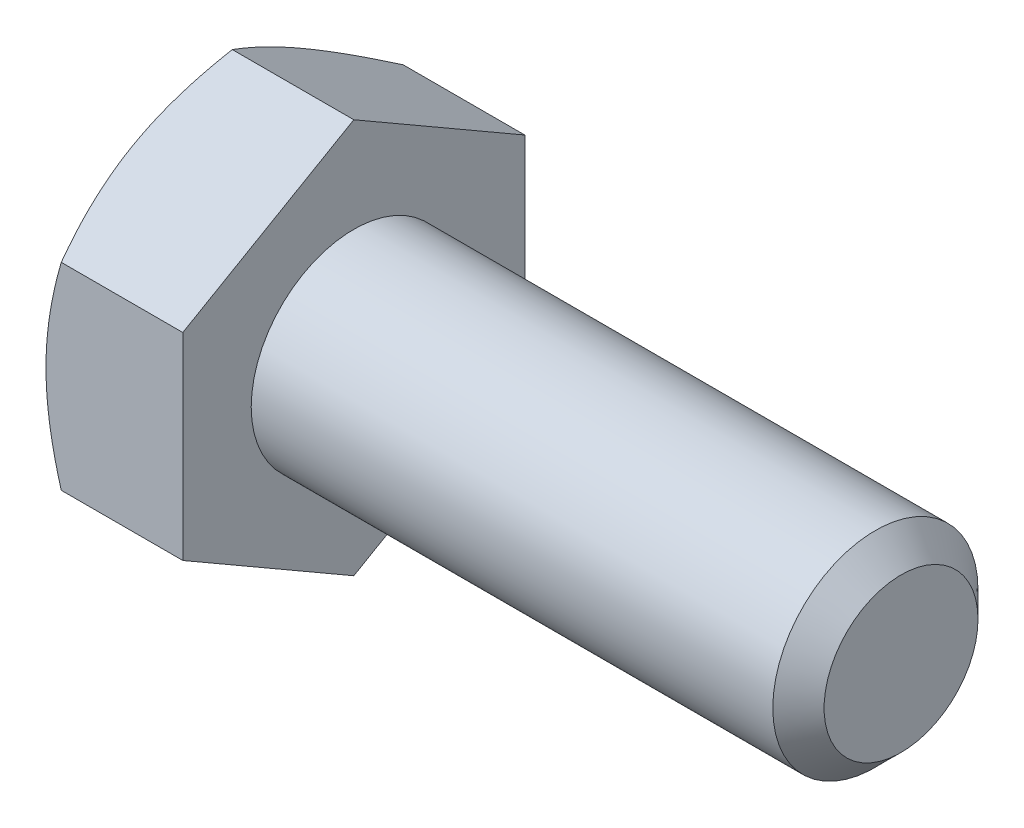
ISO-10303-21;
HEADER;
FILE_DESCRIPTION(('STEP AP214'),'2;1');
FILE_NAME('part.step','',(''),(''),'','','');
FILE_SCHEMA(('AUTOMOTIVE_DESIGN { 1 0 10303 214 1 1 1 1 }'));
ENDSEC;
DATA;
#1=APPLICATION_CONTEXT('core data for automotive mechanical design processes');
#2=APPLICATION_PROTOCOL_DEFINITION('international standard','automotive_design',2000,#1);
#3=PRODUCT_CONTEXT('',#1,'mechanical');
#4=PRODUCT('Part','Part','',(#3));
#5=PRODUCT_RELATED_PRODUCT_CATEGORY('part','',(#4));
#6=PRODUCT_DEFINITION_FORMATION('','',#4);
#7=PRODUCT_DEFINITION_CONTEXT('part definition',#1,'design');
#8=PRODUCT_DEFINITION('design','',#6,#7);
#9=PRODUCT_DEFINITION_SHAPE('','',#8);
#10=(LENGTH_UNIT() NAMED_UNIT(*) SI_UNIT(.MILLI.,.METRE.));
#11=(NAMED_UNIT(*) PLANE_ANGLE_UNIT() SI_UNIT($,.RADIAN.));
#12=(NAMED_UNIT(*) SI_UNIT($,.STERADIAN.) SOLID_ANGLE_UNIT());
#13=UNCERTAINTY_MEASURE_WITH_UNIT(LENGTH_MEASURE(1.E-05),#10,'distance_accuracy_value','');
#14=(GEOMETRIC_REPRESENTATION_CONTEXT(3) GLOBAL_UNCERTAINTY_ASSIGNED_CONTEXT((#13)) GLOBAL_UNIT_ASSIGNED_CONTEXT((#10,
#11,#12)) REPRESENTATION_CONTEXT('',''));
#15=CARTESIAN_POINT('',(0.,0.,0.));
#16=DIRECTION('',(0.,0.,1.));
#17=DIRECTION('',(1.,0.,0.));
#18=AXIS2_PLACEMENT_3D('',#15,#16,#17);
#19=CARTESIAN_POINT('',(-10.,2.88675134594813,-5.));
#20=DIRECTION('',(0.,0.,1.));
#21=DIRECTION('',(1.,0.,0.));
#22=AXIS2_PLACEMENT_3D('',#19,#20,#21);
#23=PLANE('',#22);
#24=CARTESIAN_POINT('',(-7.50175754060023,-7.8736570188767,-5.));
#25=CARTESIAN_POINT('',(-7.6086809155164,-7.65421637408501,-5.));
#26=CARTESIAN_POINT('',(-7.71461296428865,-7.43428458635667,-5.));
#27=CARTESIAN_POINT('',(-7.92393906972986,-6.99317792778182,-5.));
#28=CARTESIAN_POINT('',(-8.02733274840783,-6.77200287775446,-5.));
#29=CARTESIAN_POINT('',(-8.23152152372065,-6.32706593086417,-5.));
#30=CARTESIAN_POINT('',(-8.33230041218572,-6.10329657096095,-5.));
#31=CARTESIAN_POINT('',(-8.52988978310136,-5.65401907662692,-5.));
#32=CARTESIAN_POINT('',(-8.62670044549487,-5.42851102159104,-5.));
#33=CARTESIAN_POINT('',(-8.81850105982914,-4.96773019079145,-5.));
#34=CARTESIAN_POINT('',(-8.91331851381283,-4.73238523141451,-5.));
#35=CARTESIAN_POINT('',(-9.09606229826897,-4.25898650473719,-5.));
#36=CARTESIAN_POINT('',(-9.18398787255529,-4.02093244346304,-5.));
#37=CARTESIAN_POINT('',(-9.35072723495477,-3.54214478748224,-5.));
#38=CARTESIAN_POINT('',(-9.42955846793332,-3.30141732768299,-5.));
#39=CARTESIAN_POINT('',(-9.57565910984208,-2.81651125773826,-5.));
#40=CARTESIAN_POINT('',(-9.64293203520485,-2.5723337217778,-5.));
#41=CARTESIAN_POINT('',(-9.7624103830642,-2.08173956311767,-5.));
#42=CARTESIAN_POINT('',(-9.81470009598878,-1.83534384469814,-5.));
#43=CARTESIAN_POINT('',(-9.90133365164022,-1.33936717869396,-5.));
#44=CARTESIAN_POINT('',(-9.93567944591482,-1.08978658051681,-5.));
#45=CARTESIAN_POINT('',(-9.98324171552745,-0.59199465261108,-5.));
#46=CARTESIAN_POINT('',(-9.99673913454035,-0.343810846499259,-5.));
#47=CARTESIAN_POINT('',(-10.0022079522779,0.152820514821983,-5.));
#48=CARTESIAN_POINT('',(-9.99417903363378,0.401268073866003,-5.));
#49=CARTESIAN_POINT('',(-9.96311999213591,0.819539614676474,-5.));
#50=CARTESIAN_POINT('',(-9.94552930521965,0.989794934045119,-5.));
#51=CARTESIAN_POINT('',(-9.90127081793362,1.32912938793638,-5.));
#52=CARTESIAN_POINT('',(-9.87460188520701,1.4982083730453,-5.));
#53=CARTESIAN_POINT('',(-9.78237229170764,2.00341173301729,-5.));
#54=CARTESIAN_POINT('',(-9.7046029071478,2.337335975888,-5.));
#55=CARTESIAN_POINT('',(-9.56883106598623,2.83691487199415,-5.));
#56=CARTESIAN_POINT('',(-9.51971360302846,3.00513229800654,-5.));
#57=CARTESIAN_POINT('',(-9.41615110534967,3.33993504452566,-5.));
#58=CARTESIAN_POINT('',(-9.36170602953137,3.50652035243131,-5.));
#59=CARTESIAN_POINT('',(-9.24838071200456,3.83810926585566,-5.));
#60=CARTESIAN_POINT('',(-9.18950171787467,4.00311330167856,-5.));
#61=CARTESIAN_POINT('',(-9.06802383137711,4.33173746060676,-5.));
#62=CARTESIAN_POINT('',(-9.00542502446627,4.49535761540597,-5.));
#63=CARTESIAN_POINT('',(-8.83201950467008,4.93598294300645,-5.));
#64=CARTESIAN_POINT('',(-8.71826266901746,5.21182602366742,-5.));
#65=CARTESIAN_POINT('',(-8.48405585630304,5.76066658468267,-5.));
#66=CARTESIAN_POINT('',(-8.36360513352739,6.03366374395568,-5.));
#67=CARTESIAN_POINT('',(-8.11759609543005,6.57746623823241,-5.));
#68=CARTESIAN_POINT('',(-7.99203582558467,6.84827068606627,-5.));
#69=CARTESIAN_POINT('',(-7.73703058830433,7.38802449320275,-5.));
#70=CARTESIAN_POINT('',(-7.60758577992802,7.65697392790879,-5.));
#71=CARTESIAN_POINT('',(-7.34544789623687,8.1938194026489,-5.));
#72=CARTESIAN_POINT('',(-7.21274991821138,8.46171304378487,-5.));
#73=CARTESIAN_POINT('',(-6.94493309245099,8.99628800444129,-5.));
#74=CARTESIAN_POINT('',(-6.80981422445331,9.26296931379112,-5.));
#75=CARTESIAN_POINT('',(-6.40162739601701,10.0614145317378,-5.));
#76=CARTESIAN_POINT('',(-6.12566969103495,10.5917004378745,-5.));
#77=CARTESIAN_POINT('',(-5.59813067906912,11.5934978261984,-5.));
#78=CARTESIAN_POINT('',(-5.34706534688037,12.0652823432174,-5.));
#79=CARTESIAN_POINT('',(-4.84190825628083,13.0072652089827,-5.));
#80=CARTESIAN_POINT('',(-4.58781631088366,13.4774634574011,-5.));
#81=CARTESIAN_POINT('',(-4.07825272035931,14.4150598997455,-5.));
#82=CARTESIAN_POINT('',(-3.82278860217362,14.8824621908533,-5.));
#83=CARTESIAN_POINT('',(-3.31014393747333,15.8162766578095,-5.));
#84=CARTESIAN_POINT('',(-3.05296352877936,16.2826889092875,-5.));
#85=CARTESIAN_POINT('',(-2.79515843952086,16.7487534511426,-5.));
#86=B_SPLINE_CURVE_WITH_KNOTS('',3,(#24,#25,#26,#27,#28,#29,#30,#31,#32,#33,#34,#35,#36,#37,#38,
#39,#40,#41,#42,#43,#44,#45,#46,#47,#48,#49,#50,#51,#52,#53,#54,#55,#56,#57,#58,#59,#60,#61,#62,
#63,#64,#65,#66,#67,#68,#69,#70,#71,#72,#73,#74,#75,#76,#77,#78,#79,#80,#81,#82,#83,#84,#85),
.UNSPECIFIED.,.F.,.F.,(4,2,2,2,2,2,2,2,2,2,2,2,2,2,2,2,2,2,2,2,2,2,2,2,2,2,2,2,2,2,4),(0.,
0.732320649228784,1.46474969554234,2.20096737715445,2.93715163726605,3.69825037836021,
4.45943251165486,5.2191293658807,5.97859468349108,6.73369963721938,7.48872245001084,
8.23347928786149,8.97824710592677,9.49148539016022,10.0047877156168,11.0318914624583,
11.5575684291884,12.0832494513179,12.6087831104645,13.1343047009664,14.0293094369911,
14.9244140791771,15.819864399481,16.7152781040304,17.612136124032,18.5090016542186,
20.3023290058613,21.9056050637106,23.5089806922305,25.106957271978,26.7048070399876),.UNSPECIFIED.);
#87=CARTESIAN_POINT('',(-9.5534180126148,2.88675134594813,-5.));
#88=VERTEX_POINT('',#87);
#89=CARTESIAN_POINT('',(-10.,0.,-5.));
#90=VERTEX_POINT('',#89);
#91=EDGE_CURVE('E254',#88,#90,#86,.F.);
#92=ORIENTED_EDGE('',*,*,#91,.F.);
#93=DIRECTION('',(1.,0.,0.));
#94=VECTOR('',#93,1.);
#95=CARTESIAN_POINT('',(-10.,2.88675134594813,-5.));
#96=LINE('',#95,#94);
#97=CARTESIAN_POINT('',(-6.,2.88675134594813,-5.));
#98=VERTEX_POINT('',#97);
#99=EDGE_CURVE('E292',#88,#98,#96,.T.);
#100=ORIENTED_EDGE('',*,*,#99,.T.);
#101=DIRECTION('',(0.,-1.,0.));
#102=VECTOR('',#101,1.);
#103=CARTESIAN_POINT('',(-6.,2.88675134594813,-5.));
#104=LINE('',#103,#102);
#105=CARTESIAN_POINT('',(-6.,-2.88675134594813,-5.));
#106=VERTEX_POINT('',#105);
#107=EDGE_CURVE('E263',#98,#106,#104,.T.);
#108=ORIENTED_EDGE('',*,*,#107,.T.);
#109=DIRECTION('',(1.,0.,0.));
#110=VECTOR('',#109,1.);
#111=CARTESIAN_POINT('',(-10.,-2.88675134594813,-5.));
#112=LINE('',#111,#110);
#113=CARTESIAN_POINT('',(-9.5534180126148,-2.88675134594813,-5.));
#114=VERTEX_POINT('',#113);
#115=EDGE_CURVE('E230',#114,#106,#112,.T.);
#116=ORIENTED_EDGE('',*,*,#115,.F.);
#117=EDGE_CURVE('E169',#90,#114,#86,.F.);
#118=ORIENTED_EDGE('',*,*,#117,.F.);
#119=EDGE_LOOP('',(#92,#100,#108,#116,#118));
#120=FACE_BOUND('',#119,.T.);
#121=ADVANCED_FACE('F40',(#120),#23,.F.);
#122=CARTESIAN_POINT('',(-10.,-2.88675134594813,-5.));
#123=DIRECTION('',(0.,0.866025403784439,0.5));
#124=DIRECTION('',(0.,-0.5,0.866025403784439));
#125=AXIS2_PLACEMENT_3D('',#122,#123,#124);
#126=PLANE('',#125);
#127=CARTESIAN_POINT('',(-9.55335134394817,-2.88663587589429,-5.0002));
#128=CARTESIAN_POINT('',(-9.62661343236237,-3.01349970319368,-4.78046540547481));
#129=CARTESIAN_POINT('',(-9.69324867808191,-3.14144859993849,-4.55885141554042));
#130=CARTESIAN_POINT('',(-9.80956100898919,-3.39956193532121,-4.11178600454649));
#131=CARTESIAN_POINT('',(-9.85919695008421,-3.52973095989718,-3.88632664040923));
#132=CARTESIAN_POINT('',(-9.9364489745813,-3.78847564779798,-3.43816769477649));
#133=CARTESIAN_POINT('',(-9.96457962171651,-3.91701101576052,-3.21553790689581));
#134=CARTESIAN_POINT('',(-9.98980507804632,-4.11026620624322,-2.88081009815336));
#135=CARTESIAN_POINT('',(-9.99538654023052,-4.17472868879311,-2.76915780319494));
#136=CARTESIAN_POINT('',(-10.0007977832485,-4.30371322717528,-2.5457500293262));
#137=CARTESIAN_POINT('',(-10.0006277417418,-4.36823528110589,-2.43399455370968));
#138=CARTESIAN_POINT('',(-9.99224636820796,-4.54500768479194,-2.12781576914936));
#139=CARTESIAN_POINT('',(-9.97817022810275,-4.65719946015292,-1.93349391403278));
#140=CARTESIAN_POINT('',(-9.93353474289057,-4.88083840557981,-1.54613989800229));
#141=CARTESIAN_POINT('',(-9.90296013985249,-4.9922847895602,-1.35310909862843));
#142=CARTESIAN_POINT('',(-9.82653150637884,-5.21637431361295,-0.964974657525143));
#143=CARTESIAN_POINT('',(-9.78035362112132,-5.32898917185759,-0.769920001358262));
#144=CARTESIAN_POINT('',(-9.67554820550807,-5.55253939626498,-0.382719654641229));
#145=CARTESIAN_POINT('',(-9.61694529656263,-5.66347762579592,-0.190569004591911));
#146=CARTESIAN_POINT('',(-9.55335134394817,-5.77361816195009,0.000200000000002791));
#147=B_SPLINE_CURVE_WITH_KNOTS('',3,(#127,#128,#129,#130,#131,#132,#133,#134,#135,#136,#137,
#138,#139,#140,#141,#142,#143,#144,#145,#146),.UNSPECIFIED.,.F.,.F.,(4,2,2,2,2,2,2,2,2,4),(0.,
0.792555841363091,1.58701660053333,2.36181537487281,2.74884076077325,3.13585419177295,
3.80962362599679,4.48401723901189,5.17336882348929,5.86136694793725),.UNSPECIFIED.);
#148=CARTESIAN_POINT('',(-10.,-4.33012701892219,-2.5));
#149=VERTEX_POINT('',#148);
#150=EDGE_CURVE('E260',#114,#149,#147,.T.);
#151=ORIENTED_EDGE('',*,*,#150,.F.);
#152=ORIENTED_EDGE('',*,*,#115,.T.);
#153=DIRECTION('',(0.,-0.5,0.866025403784439));
#154=VECTOR('',#153,1.);
#155=CARTESIAN_POINT('',(-6.,-2.88675134594813,-5.));
#156=LINE('',#155,#154);
#157=CARTESIAN_POINT('',(-6.,-5.77350269189626,0.));
#158=VERTEX_POINT('',#157);
#159=EDGE_CURVE('E307',#106,#158,#156,.T.);
#160=ORIENTED_EDGE('',*,*,#159,.T.);
#161=DIRECTION('',(1.,0.,0.));
#162=VECTOR('',#161,1.);
#163=CARTESIAN_POINT('',(-10.,-5.77350269189626,0.));
#164=LINE('',#163,#162);
#165=CARTESIAN_POINT('',(-9.5534180126148,-5.77350269189626,0.));
#166=VERTEX_POINT('',#165);
#167=EDGE_CURVE('E236',#166,#158,#164,.T.);
#168=ORIENTED_EDGE('',*,*,#167,.F.);
#169=EDGE_CURVE('E189',#149,#166,#147,.T.);
#170=ORIENTED_EDGE('',*,*,#169,.F.);
#171=EDGE_LOOP('',(#151,#152,#160,#168,#170));
#172=FACE_BOUND('',#171,.T.);
#173=ADVANCED_FACE('F199',(#172),#126,.F.);
#174=CARTESIAN_POINT('',(-10.,-5.77350269189626,0.));
#175=DIRECTION('',(0.,0.866025403784439,-0.5));
#176=DIRECTION('',(0.,0.5,0.866025403784439));
#177=AXIS2_PLACEMENT_3D('',#174,#175,#176);
#178=PLANE('',#177);
#179=CARTESIAN_POINT('',(-9.55335134394817,-5.7736181619501,-0.000199999999997511));
#180=CARTESIAN_POINT('',(-9.62661343236237,-5.64675433465071,0.219534594525188));
#181=CARTESIAN_POINT('',(-9.69324867808191,-5.5188054379059,0.441148584459584));
#182=CARTESIAN_POINT('',(-9.80956100898919,-5.26069210252318,0.888213995453516));
#183=CARTESIAN_POINT('',(-9.85919695008421,-5.13052307794721,1.11367335959078));
#184=CARTESIAN_POINT('',(-9.9364489745813,-4.87177839004641,1.56183230522351));
#185=CARTESIAN_POINT('',(-9.96457962171651,-4.74324302208387,1.7844620931042));
#186=CARTESIAN_POINT('',(-9.98980507804632,-4.54998783160116,2.11918990184664));
#187=CARTESIAN_POINT('',(-9.99538654023052,-4.48552534905128,2.23084219680506));
#188=CARTESIAN_POINT('',(-10.0007977832485,-4.35654081066911,2.4542499706738));
#189=CARTESIAN_POINT('',(-10.0006277417418,-4.2920187567385,2.56600544629032));
#190=CARTESIAN_POINT('',(-9.99224636820797,-4.11524635305244,2.87218423085064));
#191=CARTESIAN_POINT('',(-9.97817022810275,-4.00305457769146,3.06650608596722));
#192=CARTESIAN_POINT('',(-9.93353474289057,-3.77941563226457,3.45386010199771));
#193=CARTESIAN_POINT('',(-9.90296013985249,-3.66796924828418,3.64689090137157));
#194=CARTESIAN_POINT('',(-9.82653150637884,-3.44387972423144,4.03502534247486));
#195=CARTESIAN_POINT('',(-9.78035362112132,-3.3312648659868,4.23007999864174));
#196=CARTESIAN_POINT('',(-9.67554820550807,-3.1077146415794,4.61728034535877));
#197=CARTESIAN_POINT('',(-9.61694529656263,-2.99677641204847,4.80943099540809));
#198=CARTESIAN_POINT('',(-9.55335134394817,-2.88663587589429,5.0002));
#199=B_SPLINE_CURVE_WITH_KNOTS('',3,(#179,#180,#181,#182,#183,#184,#185,#186,#187,#188,#189,
#190,#191,#192,#193,#194,#195,#196,#197,#198),.UNSPECIFIED.,.F.,.F.,(4,2,2,2,2,2,2,2,2,4),(0.,
0.792555841363092,1.58701660053334,2.36181537487281,2.74884076077325,3.13585419177295,
3.80962362599679,4.48401723901189,5.17336882348929,5.86136694793725),.UNSPECIFIED.);
#200=CARTESIAN_POINT('',(-10.,-4.33012701892219,2.5));
#201=VERTEX_POINT('',#200);
#202=EDGE_CURVE('E187',#166,#201,#199,.T.);
#203=ORIENTED_EDGE('',*,*,#202,.F.);
#204=ORIENTED_EDGE('',*,*,#167,.T.);
#205=DIRECTION('',(0.,0.5,0.866025403784439));
#206=VECTOR('',#205,1.);
#207=CARTESIAN_POINT('',(-6.,-5.77350269189626,0.));
#208=LINE('',#207,#206);
#209=CARTESIAN_POINT('',(-6.,-2.88675134594813,5.));
#210=VERTEX_POINT('',#209);
#211=EDGE_CURVE('E281',#158,#210,#208,.T.);
#212=ORIENTED_EDGE('',*,*,#211,.T.);
#213=DIRECTION('',(1.,0.,0.));
#214=VECTOR('',#213,1.);
#215=CARTESIAN_POINT('',(-10.,-2.88675134594813,5.));
#216=LINE('',#215,#214);
#217=CARTESIAN_POINT('',(-9.55341801261495,-2.88675134594836,5.));
#218=VERTEX_POINT('',#217);
#219=EDGE_CURVE('E278',#218,#210,#216,.T.);
#220=ORIENTED_EDGE('',*,*,#219,.F.);
#221=EDGE_CURVE('E180',#201,#218,#199,.T.);
#222=ORIENTED_EDGE('',*,*,#221,.F.);
#223=EDGE_LOOP('',(#203,#204,#212,#220,#222));
#224=FACE_BOUND('',#223,.T.);
#225=ADVANCED_FACE('F195',(#224),#178,.F.);
#226=CARTESIAN_POINT('',(-10.,-2.88675134594813,5.));
#227=DIRECTION('',(0.,0.,-1.));
#228=DIRECTION('',(0.,1.,0.));
#229=AXIS2_PLACEMENT_3D('',#226,#227,#228);
#230=PLANE('',#229);
#231=CARTESIAN_POINT('',(-7.50175753822739,-7.87365702374524,5.));
#232=CARTESIAN_POINT('',(-7.60868091324243,-7.65421637878962,5.));
#233=CARTESIAN_POINT('',(-7.71461296211349,-7.43428459089723,5.));
#234=CARTESIAN_POINT('',(-7.92393906775184,-6.99317793199379,5.));
#235=CARTESIAN_POINT('',(-8.02733274652815,-6.7720028818019,5.));
#236=CARTESIAN_POINT('',(-8.23152152203768,-6.32706593458005,5.));
#237=CARTESIAN_POINT('',(-8.33230041060112,-6.1032965745098,5.));
#238=CARTESIAN_POINT('',(-8.52988978171186,-5.6540190798406,5.));
#239=CARTESIAN_POINT('',(-8.62670044420212,-5.42851102463659,5.));
#240=CARTESIAN_POINT('',(-8.81850105873286,-4.96773019348737,5.));
#241=CARTESIAN_POINT('',(-8.91331851281604,-4.73238523392883,5.));
#242=CARTESIAN_POINT('',(-9.0960622974659,-4.25898650688543,5.));
#243=CARTESIAN_POINT('',(-9.18398787184646,-4.02093244542678,5.));
#244=CARTESIAN_POINT('',(-9.35072723442547,-3.5421447890736,5.));
#245=CARTESIAN_POINT('',(-9.42955846748937,-3.30141732908647,5.));
#246=CARTESIAN_POINT('',(-9.57565910955503,-2.81651125876089,5.));
#247=CARTESIAN_POINT('',(-9.64293203498938,-2.57233372260745,5.));
#248=CARTESIAN_POINT('',(-9.76241038299334,-2.08173956346333,5.));
#249=CARTESIAN_POINT('',(-9.81470009598553,-1.83534384475145,5.));
#250=CARTESIAN_POINT('',(-9.90133365172825,-1.33936717815539,5.));
#251=CARTESIAN_POINT('',(-9.93567944602655,-1.08978657967872,5.));
#252=CARTESIAN_POINT('',(-9.98324171563311,-0.591994651178854,5.));
#253=CARTESIAN_POINT('',(-9.99673913461725,-0.34381084477247,5.));
#254=CARTESIAN_POINT('',(-10.0022079522455,0.152820517133532,5.));
#255=CARTESIAN_POINT('',(-9.99417903352089,0.401268076467751,5.));
#256=CARTESIAN_POINT('',(-9.9631199918602,0.819539617641,5.));
#257=CARTESIAN_POINT('',(-9.94552930487954,0.989794937085518,5.));
#258=CARTESIAN_POINT('',(-9.90127081746131,1.32912939112508,5.));
#259=CARTESIAN_POINT('',(-9.87460188466691,1.49820837630644,5.));
#260=CARTESIAN_POINT('',(-9.78237229096276,2.00341173649169,5.));
#261=CARTESIAN_POINT('',(-9.70460290626464,2.33733597949887,5.));
#262=CARTESIAN_POINT('',(-9.56883106489912,2.83691487580912,5.));
#263=CARTESIAN_POINT('',(-9.5197136018729,3.00513230189104,5.));
#264=CARTESIAN_POINT('',(-9.41615110405936,3.33993504854842,5.));
#265=CARTESIAN_POINT('',(-9.36170602817474,3.50652035652279,5.));
#266=CARTESIAN_POINT('',(-9.24838071051774,3.83810927008406,5.));
#267=CARTESIAN_POINT('',(-9.18950171632397,4.00311330597516,5.));
#268=CARTESIAN_POINT('',(-9.06802382970091,4.33173746503976,5.));
#269=CARTESIAN_POINT('',(-9.00542502272846,4.49535761990717,5.));
#270=CARTESIAN_POINT('',(-8.8320195028261,4.93598294754599,5.));
#271=CARTESIAN_POINT('',(-8.71826266713566,5.21182602817914,5.));
#272=CARTESIAN_POINT('',(-8.48405585435658,5.76066658914232,5.));
#273=CARTESIAN_POINT('',(-8.3636051315541,6.0336637483911,5.));
#274=CARTESIAN_POINT('',(-8.11759609341106,6.57746624262195,5.));
#275=CARTESIAN_POINT('',(-7.99203582354682,6.84827069043415,5.));
#276=CARTESIAN_POINT('',(-7.73703058623437,7.38802449752969,5.));
#277=CARTESIAN_POINT('',(-7.60758577784481,7.65697393221643,5.));
#278=CARTESIAN_POINT('',(-7.34544789413184,8.1938194069185,5.));
#279=CARTESIAN_POINT('',(-7.2127499160978,8.46171304803573,5.));
#280=CARTESIAN_POINT('',(-6.9449330903234,8.99628800865608,5.));
#281=CARTESIAN_POINT('',(-6.80981422232027,9.26296931798858,5.));
#282=CARTESIAN_POINT('',(-6.40162739387083,10.0614145358852,5.));
#283=CARTESIAN_POINT('',(-6.12566968888453,10.5917004419909,5.));
#284=CARTESIAN_POINT('',(-5.59813067690231,11.5934978302841,5.));
#285=CARTESIAN_POINT('',(-5.34706534470067,12.065282347303,5.));
#286=CARTESIAN_POINT('',(-4.84190825407797,13.0072652130694,5.));
#287=CARTESIAN_POINT('',(-4.58781630867054,13.4774634614889,5.));
#288=CARTESIAN_POINT('',(-4.07825271812508,14.4150599038409,5.));
#289=CARTESIAN_POINT('',(-3.82278859992852,14.882462194955,5.));
#290=CARTESIAN_POINT('',(-3.31014393520766,15.8162766619247,5.));
#291=CARTESIAN_POINT('',(-3.05296352650399,16.2826889134099,5.));
#292=CARTESIAN_POINT('',(-2.79515843723617,16.7487534552724,5.));
#293=B_SPLINE_CURVE_WITH_KNOTS('',3,(#231,#232,#233,#234,#235,#236,#237,#238,#239,#240,#241,
#242,#243,#244,#245,#246,#247,#248,#249,#250,#251,#252,#253,#254,#255,#256,#257,#258,#259,#260,
#261,#262,#263,#264,#265,#266,#267,#268,#269,#270,#271,#272,#273,#274,#275,#276,#277,#278,#279,
#280,#281,#282,#283,#284,#285,#286,#287,#288,#289,#290,#291,#292),.UNSPECIFIED.,.F.,.F.,(4,2,2,
2,2,2,2,2,2,2,2,2,2,2,2,2,2,2,2,2,2,2,2,2,2,2,2,2,2,2,4),(0.,0.732320649800811,1.46474969668648,
2.20096737887664,2.93715163956625,3.69825038127721,4.45943251518887,5.21912937002973,
5.97859468825465,6.73369964288113,7.48872245656945,8.23347929529438,8.97824711423436,
9.49148539871403,10.0047877244168,11.0318914717519,11.5575684387399,12.0832494611273,
12.608783120531,13.1343047112902,14.0293094472814,14.9244140894336,15.8198644097025,
16.715278114217,17.6121361341797,18.5090016643273,20.3023290158934,21.9056050737607,
23.5089807022982,25.1069572820781,26.7048070501206),.UNSPECIFIED.);
#294=CARTESIAN_POINT('',(-10.,0.,5.));
#295=VERTEX_POINT('',#294);
#296=EDGE_CURVE('E188',#218,#295,#293,.T.);
#297=ORIENTED_EDGE('',*,*,#296,.F.);
#298=ORIENTED_EDGE('',*,*,#219,.T.);
#299=DIRECTION('',(0.,1.,0.));
#300=VECTOR('',#299,1.);
#301=CARTESIAN_POINT('',(-6.,-2.88675134594813,5.));
#302=LINE('',#301,#300);
#303=CARTESIAN_POINT('',(-6.,2.88675134594813,5.));
#304=VERTEX_POINT('',#303);
#305=EDGE_CURVE('E302',#210,#304,#302,.T.);
#306=ORIENTED_EDGE('',*,*,#305,.T.);
#307=DIRECTION('',(1.,0.,0.));
#308=VECTOR('',#307,1.);
#309=CARTESIAN_POINT('',(-10.,2.88675134594813,5.));
#310=LINE('',#309,#308);
#311=CARTESIAN_POINT('',(-9.5534180126148,2.88675134594813,5.));
#312=VERTEX_POINT('',#311);
#313=EDGE_CURVE('E284',#312,#304,#310,.T.);
#314=ORIENTED_EDGE('',*,*,#313,.F.);
#315=EDGE_CURVE('E113',#295,#312,#293,.T.);
#316=ORIENTED_EDGE('',*,*,#315,.F.);
#317=EDGE_LOOP('',(#297,#298,#306,#314,#316));
#318=FACE_BOUND('',#317,.T.);
#319=ADVANCED_FACE('F198',(#318),#230,.F.);
#320=CARTESIAN_POINT('',(-10.,2.88675134594813,5.));
#321=DIRECTION('',(0.,-0.866025403784439,-0.5));
#322=DIRECTION('',(0.,0.5,-0.866025403784438));
#323=AXIS2_PLACEMENT_3D('',#320,#321,#322);
#324=PLANE('',#323);
#325=CARTESIAN_POINT('',(-9.55335134394817,2.88663587589429,5.0002));
#326=CARTESIAN_POINT('',(-9.62661343236237,3.01349970319368,4.78046540547482));
#327=CARTESIAN_POINT('',(-9.69324867808191,3.14144859993849,4.55885141554042));
#328=CARTESIAN_POINT('',(-9.80956100898919,3.39956193532121,4.11178600454649));
#329=CARTESIAN_POINT('',(-9.85919695008421,3.52973095989718,3.88632664040923));
#330=CARTESIAN_POINT('',(-9.9364489745813,3.78847564779798,3.43816769477649));
#331=CARTESIAN_POINT('',(-9.96457962171651,3.91701101576052,3.21553790689581));
#332=CARTESIAN_POINT('',(-9.98980507804632,4.11026620624323,2.88081009815336));
#333=CARTESIAN_POINT('',(-9.99538654023052,4.17472868879311,2.76915780319494));
#334=CARTESIAN_POINT('',(-10.0007977832485,4.30371322717528,2.5457500293262));
#335=CARTESIAN_POINT('',(-10.0006277417418,4.36823528110589,2.43399455370968));
#336=CARTESIAN_POINT('',(-9.99224636820796,4.54500768479195,2.12781576914936));
#337=CARTESIAN_POINT('',(-9.97817022810275,4.65719946015293,1.93349391403278));
#338=CARTESIAN_POINT('',(-9.93353474289057,4.88083840557982,1.54613989800229));
#339=CARTESIAN_POINT('',(-9.90296013985249,4.99228478956021,1.35310909862843));
#340=CARTESIAN_POINT('',(-9.82653150637884,5.21637431361295,0.964974657525144));
#341=CARTESIAN_POINT('',(-9.78035362112132,5.32898917185759,0.769920001358262));
#342=CARTESIAN_POINT('',(-9.67554820550807,5.55253939626499,0.382719654641231));
#343=CARTESIAN_POINT('',(-9.61694529656263,5.66347762579592,0.190569004591913));
#344=CARTESIAN_POINT('',(-9.55335134394817,5.7736181619501,-0.000200000000000264));
#345=B_SPLINE_CURVE_WITH_KNOTS('',3,(#325,#326,#327,#328,#329,#330,#331,#332,#333,#334,#335,
#336,#337,#338,#339,#340,#341,#342,#343,#344),.UNSPECIFIED.,.F.,.F.,(4,2,2,2,2,2,2,2,2,4),(0.,
0.792555841363093,1.58701660053334,2.36181537487281,2.74884076077326,3.13585419177295,
3.8096236259968,4.4840172390119,5.17336882348929,5.86136694793725),.UNSPECIFIED.);
#346=CARTESIAN_POINT('',(-10.,4.33012701892219,2.5));
#347=VERTEX_POINT('',#346);
#348=EDGE_CURVE('E110',#312,#347,#345,.T.);
#349=ORIENTED_EDGE('',*,*,#348,.F.);
#350=ORIENTED_EDGE('',*,*,#313,.T.);
#351=DIRECTION('',(0.,0.5,-0.866025403784438));
#352=VECTOR('',#351,1.);
#353=CARTESIAN_POINT('',(-6.,2.88675134594813,5.));
#354=LINE('',#353,#352);
#355=CARTESIAN_POINT('',(-6.,5.77350269189626,0.));
#356=VERTEX_POINT('',#355);
#357=EDGE_CURVE('E299',#304,#356,#354,.T.);
#358=ORIENTED_EDGE('',*,*,#357,.T.);
#359=DIRECTION('',(1.,0.,0.));
#360=VECTOR('',#359,1.);
#361=CARTESIAN_POINT('',(-10.,5.77350269189626,0.));
#362=LINE('',#361,#360);
#363=CARTESIAN_POINT('',(-9.5534180126148,5.77350269189626,0.));
#364=VERTEX_POINT('',#363);
#365=EDGE_CURVE('E136',#364,#356,#362,.T.);
#366=ORIENTED_EDGE('',*,*,#365,.F.);
#367=EDGE_CURVE('E118',#347,#364,#345,.T.);
#368=ORIENTED_EDGE('',*,*,#367,.F.);
#369=EDGE_LOOP('',(#349,#350,#358,#366,#368));
#370=FACE_BOUND('',#369,.T.);
#371=ADVANCED_FACE('F134',(#370),#324,.F.);
#372=CARTESIAN_POINT('',(-10.,5.77350269189626,0.));
#373=DIRECTION('',(0.,-0.866025403784439,0.5));
#374=DIRECTION('',(0.,-0.5,-0.866025403784439));
#375=AXIS2_PLACEMENT_3D('',#372,#373,#374);
#376=PLANE('',#375);
#377=CARTESIAN_POINT('',(-9.55335134394817,5.7736181619501,0.000199999999999612));
#378=CARTESIAN_POINT('',(-9.62661343236237,5.64675433465071,-0.219534594525186));
#379=CARTESIAN_POINT('',(-9.69324867808191,5.5188054379059,-0.441148584459581));
#380=CARTESIAN_POINT('',(-9.80956100898919,5.26069210252318,-0.888213995453515));
#381=CARTESIAN_POINT('',(-9.85919695008421,5.13052307794721,-1.11367335959078));
#382=CARTESIAN_POINT('',(-9.9364489745813,4.87177839004641,-1.56183230522351));
#383=CARTESIAN_POINT('',(-9.96457962171651,4.74324302208387,-1.78446209310419));
#384=CARTESIAN_POINT('',(-9.98980507804632,4.54998783160116,-2.11918990184664));
#385=CARTESIAN_POINT('',(-9.99538654023052,4.48552534905128,-2.23084219680506));
#386=CARTESIAN_POINT('',(-10.0007977832485,4.35654081066911,-2.4542499706738));
#387=CARTESIAN_POINT('',(-10.0006277417418,4.2920187567385,-2.56600544629032));
#388=CARTESIAN_POINT('',(-9.99224636820797,4.11524635305244,-2.87218423085064));
#389=CARTESIAN_POINT('',(-9.97817022810275,4.00305457769146,-3.06650608596722));
#390=CARTESIAN_POINT('',(-9.93353474289057,3.77941563226458,-3.45386010199771));
#391=CARTESIAN_POINT('',(-9.90296013985249,3.66796924828419,-3.64689090137157));
#392=CARTESIAN_POINT('',(-9.82653150637884,3.44387972423144,-4.03502534247485));
#393=CARTESIAN_POINT('',(-9.78035362112132,3.3312648659868,-4.23007999864174));
#394=CARTESIAN_POINT('',(-9.67554820550807,3.10771464157941,-4.61728034535877));
#395=CARTESIAN_POINT('',(-9.61694529656263,2.99677641204847,-4.80943099540809));
#396=CARTESIAN_POINT('',(-9.55335134394817,2.88663587589429,-5.0002));
#397=B_SPLINE_CURVE_WITH_KNOTS('',3,(#377,#378,#379,#380,#381,#382,#383,#384,#385,#386,#387,
#388,#389,#390,#391,#392,#393,#394,#395,#396),.UNSPECIFIED.,.F.,.F.,(4,2,2,2,2,2,2,2,2,4),(0.,
0.792555841363092,1.58701660053334,2.36181537487281,2.74884076077326,3.13585419177295,
3.80962362599679,4.48401723901189,5.17336882348929,5.86136694793725),.UNSPECIFIED.);
#398=CARTESIAN_POINT('',(-10.,4.3301270189222,-2.5));
#399=VERTEX_POINT('',#398);
#400=EDGE_CURVE('E124',#364,#399,#397,.T.);
#401=ORIENTED_EDGE('',*,*,#400,.F.);
#402=ORIENTED_EDGE('',*,*,#365,.T.);
#403=DIRECTION('',(0.,-0.5,-0.866025403784439));
#404=VECTOR('',#403,1.);
#405=CARTESIAN_POINT('',(-6.,5.77350269189626,0.));
#406=LINE('',#405,#404);
#407=EDGE_CURVE('E295',#356,#98,#406,.T.);
#408=ORIENTED_EDGE('',*,*,#407,.T.);
#409=ORIENTED_EDGE('',*,*,#99,.F.);
#410=EDGE_CURVE('E131',#399,#88,#397,.T.);
#411=ORIENTED_EDGE('',*,*,#410,.F.);
#412=EDGE_LOOP('',(#401,#402,#408,#409,#411));
#413=FACE_BOUND('',#412,.T.);
#414=ADVANCED_FACE('F214',(#413),#376,.F.);
#415=CARTESIAN_POINT('',(-6.,0.,0.));
#416=DIRECTION('',(1.,0.,0.));
#417=DIRECTION('',(0.,0.,-1.));
#418=AXIS2_PLACEMENT_3D('',#415,#416,#417);
#419=CYLINDRICAL_SURFACE('',#418,3.);
#420=CARTESIAN_POINT('',(9.25,0.,0.));
#421=DIRECTION('',(1.,0.,0.));
#422=DIRECTION('',(0.,0.,-1.));
#423=AXIS2_PLACEMENT_3D('',#420,#421,#422);
#424=CIRCLE('',#423,3.);
#425=CARTESIAN_POINT('',(9.25,0.,-3.));
#426=VERTEX_POINT('',#425);
#427=EDGE_CURVE('E223',#426,#426,#424,.F.);
#428=ORIENTED_EDGE('',*,*,#427,.T.);
#429=EDGE_LOOP('',(#428));
#430=FACE_BOUND('',#429,.T.);
#431=CARTESIAN_POINT('',(-6.,0.,0.));
#432=DIRECTION('',(-1.,0.,0.));
#433=DIRECTION('',(0.,0.,1.));
#434=AXIS2_PLACEMENT_3D('',#431,#432,#433);
#435=CIRCLE('',#434,3.);
#436=CARTESIAN_POINT('',(-6.,0.,3.));
#437=VERTEX_POINT('',#436);
#438=EDGE_CURVE('E226',#437,#437,#435,.F.);
#439=ORIENTED_EDGE('',*,*,#438,.T.);
#440=EDGE_LOOP('',(#439));
#441=FACE_BOUND('',#440,.T.);
#442=ADVANCED_FACE('F211',(#430,#441),#419,.T.);
#443=CARTESIAN_POINT('',(10.,0.,0.));
#444=DIRECTION('',(1.,0.,0.));
#445=DIRECTION('',(0.,0.,-1.));
#446=AXIS2_PLACEMENT_3D('',#443,#444,#445);
#447=PLANE('',#446);
#448=CARTESIAN_POINT('',(10.,0.,0.));
#449=DIRECTION('',(1.,0.,0.));
#450=DIRECTION('',(0.,0.,-1.));
#451=AXIS2_PLACEMENT_3D('',#448,#449,#450);
#452=CIRCLE('',#451,2.25);
#453=CARTESIAN_POINT('',(10.,0.,-2.25));
#454=VERTEX_POINT('',#453);
#455=EDGE_CURVE('E229',#454,#454,#452,.T.);
#456=ORIENTED_EDGE('',*,*,#455,.T.);
#457=EDGE_LOOP('',(#456));
#458=FACE_BOUND('',#457,.T.);
#459=ADVANCED_FACE('F209',(#458),#447,.T.);
#460=CARTESIAN_POINT('',(10.,0.,0.));
#461=DIRECTION('',(-1.,0.,0.));
#462=DIRECTION('',(0.,0.,1.));
#463=AXIS2_PLACEMENT_3D('',#460,#461,#462);
#464=CONICAL_SURFACE('',#463,2.25,0.785398163397446);
#465=ORIENTED_EDGE('',*,*,#427,.F.);
#466=EDGE_LOOP('',(#465));
#467=FACE_BOUND('',#466,.T.);
#468=ORIENTED_EDGE('',*,*,#455,.F.);
#469=EDGE_LOOP('',(#468));
#470=FACE_BOUND('',#469,.T.);
#471=ADVANCED_FACE('F42',(#467,#470),#464,.T.);
#472=CARTESIAN_POINT('',(-6.,-2.88675134594813,-5.));
#473=DIRECTION('',(-1.,0.,0.));
#474=DIRECTION('',(0.,0.,1.));
#475=AXIS2_PLACEMENT_3D('',#472,#473,#474);
#476=PLANE('',#475);
#477=ORIENTED_EDGE('',*,*,#438,.F.);
#478=EDGE_LOOP('',(#477));
#479=FACE_BOUND('',#478,.T.);
#480=ORIENTED_EDGE('',*,*,#107,.F.);
#481=ORIENTED_EDGE('',*,*,#407,.F.);
#482=ORIENTED_EDGE('',*,*,#357,.F.);
#483=ORIENTED_EDGE('',*,*,#305,.F.);
#484=ORIENTED_EDGE('',*,*,#211,.F.);
#485=ORIENTED_EDGE('',*,*,#159,.F.);
#486=EDGE_LOOP('',(#480,#481,#482,#483,#484,#485));
#487=FACE_BOUND('',#486,.T.);
#488=ADVANCED_FACE('F315',(#479,#487),#476,.F.);
#489=CARTESIAN_POINT('',(-10.,0.,0.));
#490=DIRECTION('',(1.,0.,0.));
#491=DIRECTION('',(0.,0.,1.));
#492=AXIS2_PLACEMENT_3D('',#489,#490,#491);
#493=CONICAL_SURFACE('',#492,5.,1.0471975511966);
#494=ORIENTED_EDGE('',*,*,#221,.T.);
#495=ORIENTED_EDGE('',*,*,#296,.T.);
#496=CARTESIAN_POINT('',(-10.,0.,0.));
#497=DIRECTION('',(-1.,0.,0.));
#498=DIRECTION('',(0.,0.,1.));
#499=AXIS2_PLACEMENT_3D('',#496,#497,#498);
#500=CIRCLE('',#499,5.);
#501=EDGE_CURVE('E44',#201,#295,#500,.T.);
#502=ORIENTED_EDGE('',*,*,#501,.F.);
#503=EDGE_LOOP('',(#494,#495,#502));
#504=FACE_BOUND('',#503,.T.);
#505=ADVANCED_FACE('F271',(#504),#493,.T.);
#506=ORIENTED_EDGE('',*,*,#169,.T.);
#507=ORIENTED_EDGE('',*,*,#202,.T.);
#508=EDGE_CURVE('E241',#149,#201,#500,.T.);
#509=ORIENTED_EDGE('',*,*,#508,.F.);
#510=EDGE_LOOP('',(#506,#507,#509));
#511=FACE_BOUND('',#510,.T.);
#512=ADVANCED_FACE('F268',(#511),#493,.T.);
#513=ORIENTED_EDGE('',*,*,#117,.T.);
#514=ORIENTED_EDGE('',*,*,#150,.T.);
#515=EDGE_CURVE('E243',#90,#149,#500,.T.);
#516=ORIENTED_EDGE('',*,*,#515,.F.);
#517=EDGE_LOOP('',(#513,#514,#516));
#518=FACE_BOUND('',#517,.T.);
#519=ADVANCED_FACE('F163',(#518),#493,.T.);
#520=ORIENTED_EDGE('',*,*,#91,.T.);
#521=EDGE_CURVE('E50',#399,#90,#500,.T.);
#522=ORIENTED_EDGE('',*,*,#521,.F.);
#523=ORIENTED_EDGE('',*,*,#410,.T.);
#524=EDGE_LOOP('',(#520,#522,#523));
#525=FACE_BOUND('',#524,.T.);
#526=ADVANCED_FACE('F159',(#525),#493,.T.);
#527=ORIENTED_EDGE('',*,*,#367,.T.);
#528=ORIENTED_EDGE('',*,*,#400,.T.);
#529=EDGE_CURVE('E12',#347,#399,#500,.T.);
#530=ORIENTED_EDGE('',*,*,#529,.F.);
#531=EDGE_LOOP('',(#527,#528,#530));
#532=FACE_BOUND('',#531,.T.);
#533=ADVANCED_FACE('F122',(#532),#493,.T.);
#534=ORIENTED_EDGE('',*,*,#315,.T.);
#535=ORIENTED_EDGE('',*,*,#348,.T.);
#536=CARTESIAN_POINT('',(-10.,0.,0.));
#537=DIRECTION('',(-1.,0.,0.));
#538=DIRECTION('',(0.,0.,1.));
#539=AXIS2_PLACEMENT_3D('',#536,#537,#538);
#540=CIRCLE('',#539,5.);
#541=EDGE_CURVE('E57',#295,#347,#540,.T.);
#542=ORIENTED_EDGE('',*,*,#541,.F.);
#543=EDGE_LOOP('',(#534,#535,#542));
#544=FACE_BOUND('',#543,.T.);
#545=ADVANCED_FACE('F111',(#544),#493,.T.);
#546=CARTESIAN_POINT('',(-10.,-2.88675134594813,-5.));
#547=DIRECTION('',(-1.,0.,0.));
#548=DIRECTION('',(0.,0.,1.));
#549=AXIS2_PLACEMENT_3D('',#546,#547,#548);
#550=PLANE('',#549);
#551=ORIENTED_EDGE('',*,*,#501,.T.);
#552=ORIENTED_EDGE('',*,*,#541,.T.);
#553=ORIENTED_EDGE('',*,*,#529,.T.);
#554=ORIENTED_EDGE('',*,*,#521,.T.);
#555=ORIENTED_EDGE('',*,*,#515,.T.);
#556=ORIENTED_EDGE('',*,*,#508,.T.);
#557=EDGE_LOOP('',(#551,#552,#553,#554,#555,#556));
#558=FACE_BOUND('',#557,.T.);
#559=ADVANCED_FACE('F127',(#558),#550,.T.);
#560=CLOSED_SHELL('',(#121,#173,#225,#319,#371,#414,#442,#459,#471,#488,#505,#512,#519,#526,
#533,#545,#559));
#561=MANIFOLD_SOLID_BREP('B2',#560);
#562=ADVANCED_BREP_SHAPE_REPRESENTATION('',(#18,#561),#14);
#563=SHAPE_DEFINITION_REPRESENTATION(#9,#562);
ENDSEC;
END-ISO-10303-21;
